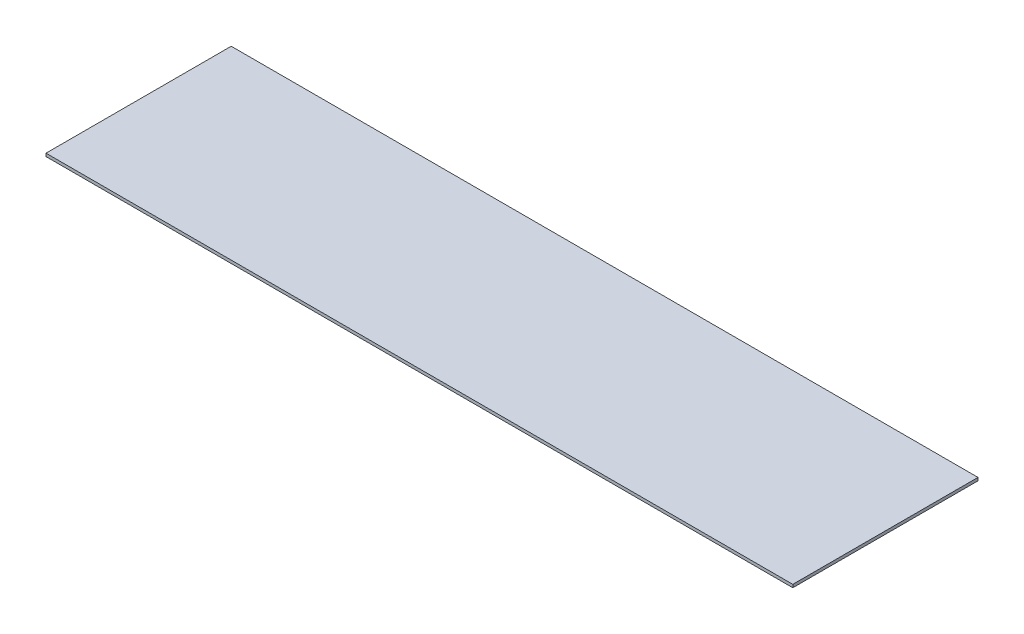
ISO-10303-21;
HEADER;
FILE_DESCRIPTION(('STEP AP214'),'2;1');
FILE_NAME('part.step','',(''),(''),'','','');
FILE_SCHEMA(('AUTOMOTIVE_DESIGN { 1 0 10303 214 1 1 1 1 }'));
ENDSEC;
DATA;
#1=APPLICATION_CONTEXT('core data for automotive mechanical design processes');
#2=APPLICATION_PROTOCOL_DEFINITION('international standard','automotive_design',2000,#1);
#3=PRODUCT_CONTEXT('',#1,'mechanical');
#4=PRODUCT('Part','Part','',(#3));
#5=PRODUCT_RELATED_PRODUCT_CATEGORY('part','',(#4));
#6=PRODUCT_DEFINITION_FORMATION('','',#4);
#7=PRODUCT_DEFINITION_CONTEXT('part definition',#1,'design');
#8=PRODUCT_DEFINITION('design','',#6,#7);
#9=PRODUCT_DEFINITION_SHAPE('','',#8);
#10=(LENGTH_UNIT() NAMED_UNIT(*) SI_UNIT(.MILLI.,.METRE.));
#11=(NAMED_UNIT(*) PLANE_ANGLE_UNIT() SI_UNIT($,.RADIAN.));
#12=(NAMED_UNIT(*) SI_UNIT($,.STERADIAN.) SOLID_ANGLE_UNIT());
#13=UNCERTAINTY_MEASURE_WITH_UNIT(LENGTH_MEASURE(1.E-05),#10,'distance_accuracy_value','');
#14=(GEOMETRIC_REPRESENTATION_CONTEXT(3) GLOBAL_UNCERTAINTY_ASSIGNED_CONTEXT((#13)) GLOBAL_UNIT_ASSIGNED_CONTEXT((#10,
#11,#12)) REPRESENTATION_CONTEXT('',''));
#15=CARTESIAN_POINT('',(0.,0.,0.));
#16=DIRECTION('',(0.,0.,1.));
#17=DIRECTION('',(1.,0.,0.));
#18=AXIS2_PLACEMENT_3D('',#15,#16,#17);
#19=CARTESIAN_POINT('',(-111.489361702128,1.,19.4574468085106));
#20=DIRECTION('',(1.,0.,0.));
#21=DIRECTION('',(0.,0.,-1.));
#22=AXIS2_PLACEMENT_3D('',#19,#20,#21);
#23=PLANE('',#22);
#24=DIRECTION('',(0.,0.,1.));
#25=VECTOR('',#24,1.);
#26=CARTESIAN_POINT('',(-111.489361702128,0.,19.4574468085106));
#27=LINE('',#26,#25);
#28=CARTESIAN_POINT('',(-111.489361702128,0.,19.4574468085106));
#29=VERTEX_POINT('',#28);
#30=CARTESIAN_POINT('',(-111.489361702128,0.,81.4574468085106));
#31=VERTEX_POINT('',#30);
#32=EDGE_CURVE('E107',#29,#31,#27,.T.);
#33=ORIENTED_EDGE('',*,*,#32,.T.);
#34=DIRECTION('',(0.,-1.,0.));
#35=VECTOR('',#34,1.);
#36=CARTESIAN_POINT('',(-111.489361702128,1.,81.4574468085106));
#37=LINE('',#36,#35);
#38=CARTESIAN_POINT('',(-111.489361702128,1.,81.4574468085106));
#39=VERTEX_POINT('',#38);
#40=EDGE_CURVE('E11',#39,#31,#37,.T.);
#41=ORIENTED_EDGE('',*,*,#40,.F.);
#42=DIRECTION('',(0.,0.,1.));
#43=VECTOR('',#42,1.);
#44=CARTESIAN_POINT('',(-111.489361702128,1.,19.4574468085106));
#45=LINE('',#44,#43);
#46=CARTESIAN_POINT('',(-111.489361702128,1.,19.4574468085106));
#47=VERTEX_POINT('',#46);
#48=EDGE_CURVE('E91',#47,#39,#45,.T.);
#49=ORIENTED_EDGE('',*,*,#48,.F.);
#50=DIRECTION('',(0.,-1.,0.));
#51=VECTOR('',#50,1.);
#52=CARTESIAN_POINT('',(-111.489361702128,1.,19.4574468085106));
#53=LINE('',#52,#51);
#54=EDGE_CURVE('E103',#47,#29,#53,.T.);
#55=ORIENTED_EDGE('',*,*,#54,.T.);
#56=EDGE_LOOP('',(#33,#41,#49,#55));
#57=FACE_BOUND('',#56,.T.);
#58=ADVANCED_FACE('F39',(#57),#23,.F.);
#59=CARTESIAN_POINT('',(-111.489361702128,1.,81.4574468085106));
#60=DIRECTION('',(0.,0.,-1.));
#61=DIRECTION('',(-1.,0.,0.));
#62=AXIS2_PLACEMENT_3D('',#59,#60,#61);
#63=PLANE('',#62);
#64=DIRECTION('',(1.,0.,0.));
#65=VECTOR('',#64,1.);
#66=CARTESIAN_POINT('',(-111.489361702128,0.,81.4574468085106));
#67=LINE('',#66,#65);
#68=CARTESIAN_POINT('',(138.510638297872,0.,81.4574468085106));
#69=VERTEX_POINT('',#68);
#70=EDGE_CURVE('E96',#31,#69,#67,.T.);
#71=ORIENTED_EDGE('',*,*,#70,.T.);
#72=DIRECTION('',(0.,-1.,0.));
#73=VECTOR('',#72,1.);
#74=CARTESIAN_POINT('',(138.510638297872,1.,81.4574468085106));
#75=LINE('',#74,#73);
#76=CARTESIAN_POINT('',(138.510638297872,1.,81.4574468085106));
#77=VERTEX_POINT('',#76);
#78=EDGE_CURVE('E48',#77,#69,#75,.T.);
#79=ORIENTED_EDGE('',*,*,#78,.F.);
#80=DIRECTION('',(1.,0.,0.));
#81=VECTOR('',#80,1.);
#82=CARTESIAN_POINT('',(-111.489361702128,1.,81.4574468085106));
#83=LINE('',#82,#81);
#84=EDGE_CURVE('E86',#39,#77,#83,.T.);
#85=ORIENTED_EDGE('',*,*,#84,.F.);
#86=ORIENTED_EDGE('',*,*,#40,.T.);
#87=EDGE_LOOP('',(#71,#79,#85,#86));
#88=FACE_BOUND('',#87,.T.);
#89=ADVANCED_FACE('F95',(#88),#63,.F.);
#90=CARTESIAN_POINT('',(138.510638297872,1.,19.4574468085106));
#91=DIRECTION('',(-1.,0.,0.));
#92=DIRECTION('',(0.,0.,1.));
#93=AXIS2_PLACEMENT_3D('',#90,#91,#92);
#94=PLANE('',#93);
#95=DIRECTION('',(0.,0.,-1.));
#96=VECTOR('',#95,1.);
#97=CARTESIAN_POINT('',(138.510638297872,0.,19.4574468085106));
#98=LINE('',#97,#96);
#99=CARTESIAN_POINT('',(138.510638297872,0.,19.4574468085106));
#100=VERTEX_POINT('',#99);
#101=EDGE_CURVE('E73',#69,#100,#98,.T.);
#102=ORIENTED_EDGE('',*,*,#101,.T.);
#103=DIRECTION('',(0.,-1.,0.));
#104=VECTOR('',#103,1.);
#105=CARTESIAN_POINT('',(138.510638297872,1.,19.4574468085106));
#106=LINE('',#105,#104);
#107=CARTESIAN_POINT('',(138.510638297872,1.,19.4574468085106));
#108=VERTEX_POINT('',#107);
#109=EDGE_CURVE('E98',#108,#100,#106,.T.);
#110=ORIENTED_EDGE('',*,*,#109,.F.);
#111=DIRECTION('',(0.,0.,-1.));
#112=VECTOR('',#111,1.);
#113=CARTESIAN_POINT('',(138.510638297872,1.,19.4574468085106));
#114=LINE('',#113,#112);
#115=EDGE_CURVE('E89',#77,#108,#114,.T.);
#116=ORIENTED_EDGE('',*,*,#115,.F.);
#117=ORIENTED_EDGE('',*,*,#78,.T.);
#118=EDGE_LOOP('',(#102,#110,#116,#117));
#119=FACE_BOUND('',#118,.T.);
#120=ADVANCED_FACE('F99',(#119),#94,.F.);
#121=CARTESIAN_POINT('',(-111.489361702128,1.,19.4574468085106));
#122=DIRECTION('',(0.,0.,1.));
#123=DIRECTION('',(1.,0.,0.));
#124=AXIS2_PLACEMENT_3D('',#121,#122,#123);
#125=PLANE('',#124);
#126=DIRECTION('',(-1.,0.,0.));
#127=VECTOR('',#126,1.);
#128=CARTESIAN_POINT('',(-111.489361702128,0.,19.4574468085106));
#129=LINE('',#128,#127);
#130=EDGE_CURVE('E79',#100,#29,#129,.T.);
#131=ORIENTED_EDGE('',*,*,#130,.T.);
#132=ORIENTED_EDGE('',*,*,#54,.F.);
#133=DIRECTION('',(-1.,0.,0.));
#134=VECTOR('',#133,1.);
#135=CARTESIAN_POINT('',(-111.489361702128,1.,19.4574468085106));
#136=LINE('',#135,#134);
#137=EDGE_CURVE('E56',#108,#47,#136,.T.);
#138=ORIENTED_EDGE('',*,*,#137,.F.);
#139=ORIENTED_EDGE('',*,*,#109,.T.);
#140=EDGE_LOOP('',(#131,#132,#138,#139));
#141=FACE_BOUND('',#140,.T.);
#142=ADVANCED_FACE('F120',(#141),#125,.F.);
#143=CARTESIAN_POINT('',(0.,1.,0.));
#144=DIRECTION('',(0.,1.,0.));
#145=DIRECTION('',(0.,0.,1.));
#146=AXIS2_PLACEMENT_3D('',#143,#144,#145);
#147=PLANE('',#146);
#148=ORIENTED_EDGE('',*,*,#48,.T.);
#149=ORIENTED_EDGE('',*,*,#84,.T.);
#150=ORIENTED_EDGE('',*,*,#115,.T.);
#151=ORIENTED_EDGE('',*,*,#137,.T.);
#152=EDGE_LOOP('',(#148,#149,#150,#151));
#153=FACE_BOUND('',#152,.T.);
#154=ADVANCED_FACE('F87',(#153),#147,.T.);
#155=CARTESIAN_POINT('',(0.,0.,0.));
#156=DIRECTION('',(0.,1.,0.));
#157=DIRECTION('',(0.,0.,1.));
#158=AXIS2_PLACEMENT_3D('',#155,#156,#157);
#159=PLANE('',#158);
#160=ORIENTED_EDGE('',*,*,#32,.F.);
#161=ORIENTED_EDGE('',*,*,#130,.F.);
#162=ORIENTED_EDGE('',*,*,#101,.F.);
#163=ORIENTED_EDGE('',*,*,#70,.F.);
#164=EDGE_LOOP('',(#160,#161,#162,#163));
#165=FACE_BOUND('',#164,.T.);
#166=ADVANCED_FACE('F123',(#165),#159,.F.);
#167=CLOSED_SHELL('',(#58,#89,#120,#142,#154,#166));
#168=MANIFOLD_SOLID_BREP('B2',#167);
#169=ADVANCED_BREP_SHAPE_REPRESENTATION('',(#18,#168),#14);
#170=SHAPE_DEFINITION_REPRESENTATION(#9,#169);
ENDSEC;
END-ISO-10303-21;
